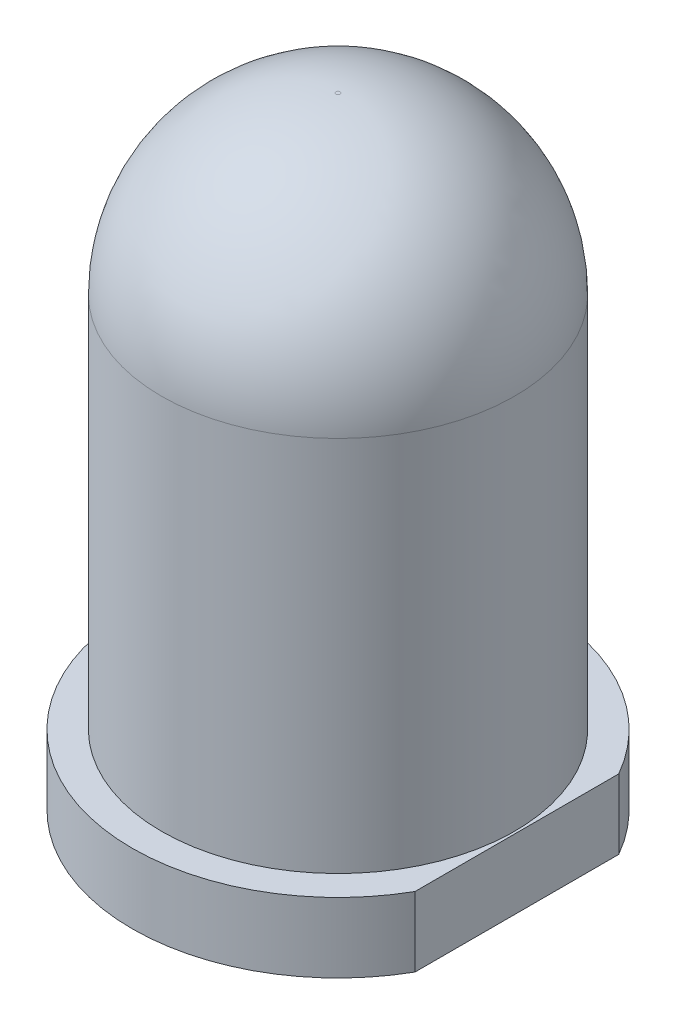
ISO-10303-21;
HEADER;
FILE_DESCRIPTION(('STEP AP214'),'2;1');
FILE_NAME('part.step','',(''),(''),'','','');
FILE_SCHEMA(('AUTOMOTIVE_DESIGN { 1 0 10303 214 1 1 1 1 }'));
ENDSEC;
DATA;
#1=APPLICATION_CONTEXT('core data for automotive mechanical design processes');
#2=APPLICATION_PROTOCOL_DEFINITION('international standard','automotive_design',2000,#1);
#3=PRODUCT_CONTEXT('',#1,'mechanical');
#4=PRODUCT('Part','Part','',(#3));
#5=PRODUCT_RELATED_PRODUCT_CATEGORY('part','',(#4));
#6=PRODUCT_DEFINITION_FORMATION('','',#4);
#7=PRODUCT_DEFINITION_CONTEXT('part definition',#1,'design');
#8=PRODUCT_DEFINITION('design','',#6,#7);
#9=PRODUCT_DEFINITION_SHAPE('','',#8);
#10=(LENGTH_UNIT() NAMED_UNIT(*) SI_UNIT(.MILLI.,.METRE.));
#11=(NAMED_UNIT(*) PLANE_ANGLE_UNIT() SI_UNIT($,.RADIAN.));
#12=(NAMED_UNIT(*) SI_UNIT($,.STERADIAN.) SOLID_ANGLE_UNIT());
#13=UNCERTAINTY_MEASURE_WITH_UNIT(LENGTH_MEASURE(1.E-05),#10,'distance_accuracy_value','');
#14=(GEOMETRIC_REPRESENTATION_CONTEXT(3) GLOBAL_UNCERTAINTY_ASSIGNED_CONTEXT((#13)) GLOBAL_UNIT_ASSIGNED_CONTEXT((#10,
#11,#12)) REPRESENTATION_CONTEXT('',''));
#15=CARTESIAN_POINT('',(0.,0.,0.));
#16=DIRECTION('',(0.,0.,1.));
#17=DIRECTION('',(1.,0.,0.));
#18=AXIS2_PLACEMENT_3D('',#15,#16,#17);
#19=CARTESIAN_POINT('',(0.,1.,0.));
#20=DIRECTION('',(0.,-1.,0.));
#21=DIRECTION('',(0.,0.,-1.));
#22=AXIS2_PLACEMENT_3D('',#19,#20,#21);
#23=CYLINDRICAL_SURFACE('',#22,2.95);
#24=CARTESIAN_POINT('',(0.,0.,0.));
#25=DIRECTION('',(0.,-1.,0.));
#26=DIRECTION('',(0.,0.,-1.));
#27=AXIS2_PLACEMENT_3D('',#24,#25,#26);
#28=CIRCLE('',#27,2.95);
#29=CARTESIAN_POINT('',(2.56322111794811,0.,1.46027309107059));
#30=VERTEX_POINT('',#29);
#31=CARTESIAN_POINT('',(2.56322111794811,0.,-1.46027309107059));
#32=VERTEX_POINT('',#31);
#33=EDGE_CURVE('E67',#30,#32,#28,.T.);
#34=ORIENTED_EDGE('',*,*,#33,.F.);
#35=DIRECTION('',(0.,-1.,0.));
#36=VECTOR('',#35,1.);
#37=CARTESIAN_POINT('',(2.56322111794811,1.,1.46027309107059));
#38=LINE('',#37,#36);
#39=CARTESIAN_POINT('',(2.56322111794811,1.,1.46027309107059));
#40=VERTEX_POINT('',#39);
#41=EDGE_CURVE('E50',#40,#30,#38,.T.);
#42=ORIENTED_EDGE('',*,*,#41,.F.);
#43=CARTESIAN_POINT('',(0.,1.,0.));
#44=DIRECTION('',(0.,-1.,0.));
#45=DIRECTION('',(0.,0.,-1.));
#46=AXIS2_PLACEMENT_3D('',#43,#44,#45);
#47=CIRCLE('',#46,2.95);
#48=CARTESIAN_POINT('',(2.56322111794811,1.,-1.46027309107059));
#49=VERTEX_POINT('',#48);
#50=EDGE_CURVE('E72',#40,#49,#47,.T.);
#51=ORIENTED_EDGE('',*,*,#50,.T.);
#52=DIRECTION('',(0.,-1.,0.));
#53=VECTOR('',#52,1.);
#54=CARTESIAN_POINT('',(2.56322111794811,1.,-1.46027309107059));
#55=LINE('',#54,#53);
#56=EDGE_CURVE('E56',#49,#32,#55,.T.);
#57=ORIENTED_EDGE('',*,*,#56,.T.);
#58=EDGE_LOOP('',(#34,#42,#51,#57));
#59=FACE_BOUND('',#58,.T.);
#60=ADVANCED_FACE('F33',(#59),#23,.T.);
#61=CARTESIAN_POINT('',(2.56322111794811,1.,-1.46027309107059));
#62=DIRECTION('',(1.,0.,0.));
#63=DIRECTION('',(0.,0.,-1.));
#64=AXIS2_PLACEMENT_3D('',#61,#62,#63);
#65=PLANE('',#64);
#66=DIRECTION('',(0.,0.,1.));
#67=VECTOR('',#66,1.);
#68=CARTESIAN_POINT('',(2.56322111794811,0.,-1.46027309107059));
#69=LINE('',#68,#67);
#70=EDGE_CURVE('E63',#32,#30,#69,.T.);
#71=ORIENTED_EDGE('',*,*,#70,.F.);
#72=ORIENTED_EDGE('',*,*,#56,.F.);
#73=DIRECTION('',(0.,0.,1.));
#74=VECTOR('',#73,1.);
#75=CARTESIAN_POINT('',(2.56322111794811,1.,-1.46027309107059));
#76=LINE('',#75,#74);
#77=EDGE_CURVE('E65',#49,#40,#76,.T.);
#78=ORIENTED_EDGE('',*,*,#77,.T.);
#79=ORIENTED_EDGE('',*,*,#41,.T.);
#80=EDGE_LOOP('',(#71,#72,#78,#79));
#81=FACE_BOUND('',#80,.T.);
#82=ADVANCED_FACE('F61',(#81),#65,.T.);
#83=CARTESIAN_POINT('',(0.,1.,0.));
#84=DIRECTION('',(0.,-1.,0.));
#85=DIRECTION('',(0.,0.,-1.));
#86=AXIS2_PLACEMENT_3D('',#83,#84,#85);
#87=PLANE('',#86);
#88=CARTESIAN_POINT('',(0.,1.,0.));
#89=DIRECTION('',(0.,1.,0.));
#90=DIRECTION('',(0.,0.,1.));
#91=AXIS2_PLACEMENT_3D('',#88,#89,#90);
#92=CIRCLE('',#91,2.53);
#93=CARTESIAN_POINT('',(0.,1.,2.53));
#94=VERTEX_POINT('',#93);
#95=EDGE_CURVE('E69',#94,#94,#92,.T.);
#96=ORIENTED_EDGE('',*,*,#95,.F.);
#97=EDGE_LOOP('',(#96));
#98=FACE_BOUND('',#97,.T.);
#99=ORIENTED_EDGE('',*,*,#50,.F.);
#100=ORIENTED_EDGE('',*,*,#77,.F.);
#101=EDGE_LOOP('',(#99,#100));
#102=FACE_BOUND('',#101,.T.);
#103=ADVANCED_FACE('F94',(#98,#102),#87,.F.);
#104=CARTESIAN_POINT('',(0.,0.,0.));
#105=DIRECTION('',(0.,-1.,0.));
#106=DIRECTION('',(0.,0.,-1.));
#107=AXIS2_PLACEMENT_3D('',#104,#105,#106);
#108=PLANE('',#107);
#109=ORIENTED_EDGE('',*,*,#33,.T.);
#110=ORIENTED_EDGE('',*,*,#70,.T.);
#111=EDGE_LOOP('',(#109,#110));
#112=FACE_BOUND('',#111,.T.);
#113=ADVANCED_FACE('F71',(#112),#108,.T.);
#114=CARTESIAN_POINT('',(0.,1.,0.));
#115=DIRECTION('',(0.,1.,0.));
#116=DIRECTION('',(0.,0.,1.));
#117=AXIS2_PLACEMENT_3D('',#114,#115,#116);
#118=CYLINDRICAL_SURFACE('',#117,2.53);
#119=CARTESIAN_POINT('',(0.,6.4,0.));
#120=DIRECTION('',(0.,1.,0.));
#121=DIRECTION('',(0.,0.,1.));
#122=AXIS2_PLACEMENT_3D('',#119,#120,#121);
#123=CIRCLE('',#122,2.53);
#124=CARTESIAN_POINT('',(0.,6.4,2.53));
#125=VERTEX_POINT('',#124);
#126=EDGE_CURVE('E11',#125,#125,#123,.F.);
#127=ORIENTED_EDGE('',*,*,#126,.T.);
#128=EDGE_LOOP('',(#127));
#129=FACE_BOUND('',#128,.T.);
#130=ORIENTED_EDGE('',*,*,#95,.T.);
#131=EDGE_LOOP('',(#130));
#132=FACE_BOUND('',#131,.T.);
#133=ADVANCED_FACE('F87',(#129,#132),#118,.T.);
#134=CARTESIAN_POINT('',(0.,8.9,0.));
#135=DIRECTION('',(0.,1.,0.));
#136=DIRECTION('',(0.,0.,1.));
#137=AXIS2_PLACEMENT_3D('',#134,#135,#136);
#138=PLANE('',#137);
#139=CARTESIAN_POINT('',(0.,8.9,0.));
#140=DIRECTION('',(0.,1.,0.));
#141=DIRECTION('',(0.,0.,1.));
#142=AXIS2_PLACEMENT_3D('',#139,#140,#141);
#143=CIRCLE('',#142,0.0300000000000001);
#144=CARTESIAN_POINT('',(0.,8.9,0.0300000000000001));
#145=VERTEX_POINT('',#144);
#146=EDGE_CURVE('E42',#145,#145,#143,.T.);
#147=ORIENTED_EDGE('',*,*,#146,.T.);
#148=EDGE_LOOP('',(#147));
#149=FACE_BOUND('',#148,.T.);
#150=ADVANCED_FACE('F80',(#149),#138,.T.);
#151=CARTESIAN_POINT('',(0.,6.4,0.));
#152=DIRECTION('',(0.,1.,0.));
#153=DIRECTION('',(0.,0.,1.));
#154=AXIS2_PLACEMENT_3D('',#151,#152,#153);
#155=DEGENERATE_TOROIDAL_SURFACE('',#154,0.0300000000000001,2.5,.T.);
#156=ORIENTED_EDGE('',*,*,#126,.F.);
#157=EDGE_LOOP('',(#156));
#158=FACE_BOUND('',#157,.T.);
#159=ORIENTED_EDGE('',*,*,#146,.F.);
#160=EDGE_LOOP('',(#159));
#161=FACE_BOUND('',#160,.T.);
#162=ADVANCED_FACE('F35',(#158,#161),#155,.T.);
#163=CLOSED_SHELL('',(#60,#82,#103,#113,#133,#150,#162));
#164=MANIFOLD_SOLID_BREP('B2',#163);
#165=ADVANCED_BREP_SHAPE_REPRESENTATION('',(#18,#164),#14);
#166=SHAPE_DEFINITION_REPRESENTATION(#9,#165);
ENDSEC;
END-ISO-10303-21;
